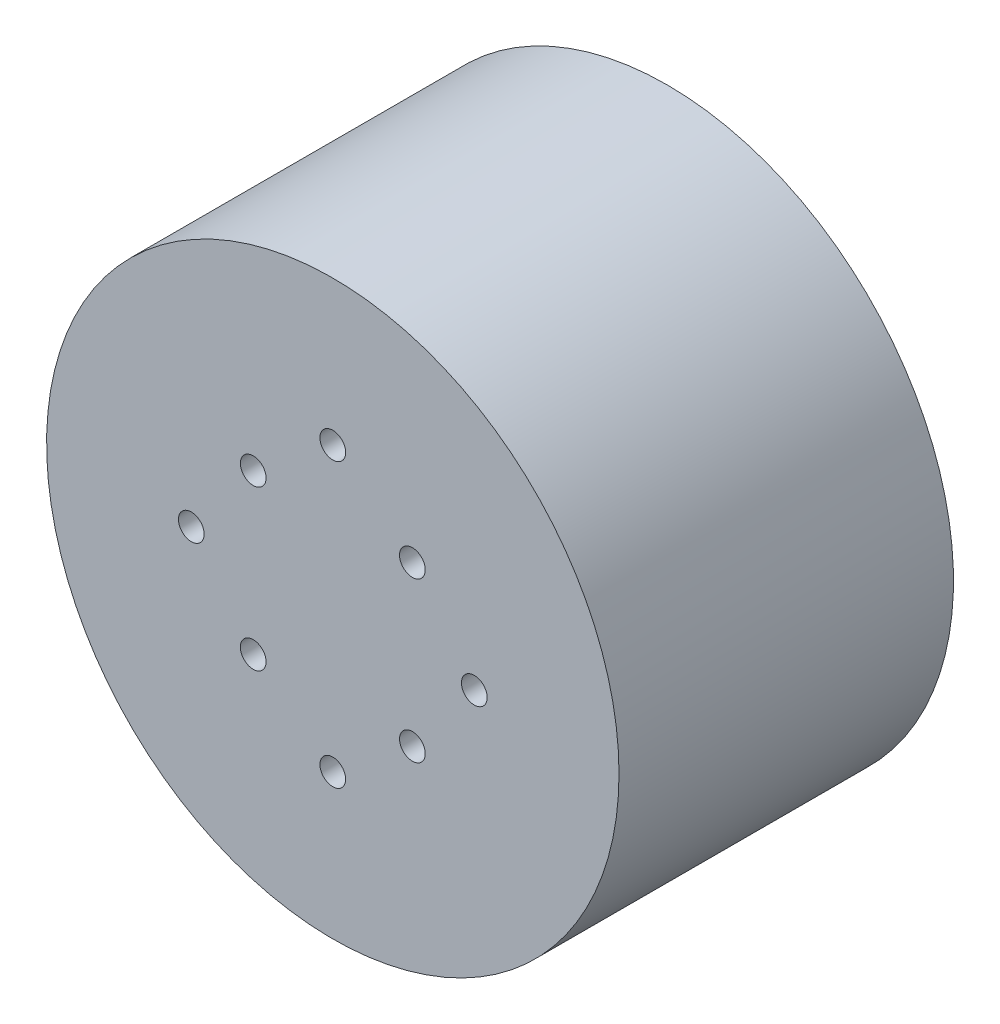
ISO-10303-21;
HEADER;
FILE_DESCRIPTION(('STEP AP214'),'2;1');
FILE_NAME('part.step','',(''),(''),'','','');
FILE_SCHEMA(('AUTOMOTIVE_DESIGN { 1 0 10303 214 1 1 1 1 }'));
ENDSEC;
DATA;
#1=APPLICATION_CONTEXT('core data for automotive mechanical design processes');
#2=APPLICATION_PROTOCOL_DEFINITION('international standard','automotive_design',2000,#1);
#3=PRODUCT_CONTEXT('',#1,'mechanical');
#4=PRODUCT('Part','Part','',(#3));
#5=PRODUCT_RELATED_PRODUCT_CATEGORY('part','',(#4));
#6=PRODUCT_DEFINITION_FORMATION('','',#4);
#7=PRODUCT_DEFINITION_CONTEXT('part definition',#1,'design');
#8=PRODUCT_DEFINITION('design','',#6,#7);
#9=PRODUCT_DEFINITION_SHAPE('','',#8);
#10=(LENGTH_UNIT() NAMED_UNIT(*) SI_UNIT(.MILLI.,.METRE.));
#11=(NAMED_UNIT(*) PLANE_ANGLE_UNIT() SI_UNIT($,.RADIAN.));
#12=(NAMED_UNIT(*) SI_UNIT($,.STERADIAN.) SOLID_ANGLE_UNIT());
#13=UNCERTAINTY_MEASURE_WITH_UNIT(LENGTH_MEASURE(1.E-05),#10,'distance_accuracy_value','');
#14=(GEOMETRIC_REPRESENTATION_CONTEXT(3) GLOBAL_UNCERTAINTY_ASSIGNED_CONTEXT((#13)) GLOBAL_UNIT_ASSIGNED_CONTEXT((#10,
#11,#12)) REPRESENTATION_CONTEXT('',''));
#15=CARTESIAN_POINT('',(0.,0.,0.));
#16=DIRECTION('',(0.,0.,1.));
#17=DIRECTION('',(1.,0.,0.));
#18=AXIS2_PLACEMENT_3D('',#15,#16,#17);
#19=CARTESIAN_POINT('',(0.,0.,52.));
#20=DIRECTION('',(0.,0.,-1.));
#21=DIRECTION('',(-1.,0.,0.));
#22=AXIS2_PLACEMENT_3D('',#19,#20,#21);
#23=CYLINDRICAL_SURFACE('',#22,44.5);
#24=CARTESIAN_POINT('',(0.,0.,52.));
#25=DIRECTION('',(0.,0.,1.));
#26=DIRECTION('',(1.,0.,0.));
#27=AXIS2_PLACEMENT_3D('',#24,#25,#26);
#28=CIRCLE('',#27,44.5);
#29=CARTESIAN_POINT('',(44.5,0.,52.));
#30=VERTEX_POINT('',#29);
#31=EDGE_CURVE('E222',#30,#30,#28,.T.);
#32=ORIENTED_EDGE('',*,*,#31,.F.);
#33=EDGE_LOOP('',(#32));
#34=FACE_BOUND('',#33,.T.);
#35=CARTESIAN_POINT('',(0.,0.,10.));
#36=DIRECTION('',(0.,0.,1.));
#37=DIRECTION('',(1.,0.,0.));
#38=AXIS2_PLACEMENT_3D('',#35,#36,#37);
#39=CIRCLE('',#38,44.5);
#40=CARTESIAN_POINT('',(-38.5046726518453,22.3078502768473,10.));
#41=VERTEX_POINT('',#40);
#42=CARTESIAN_POINT('',(-38.5046726518453,-22.3078502768473,10.));
#43=VERTEX_POINT('',#42);
#44=EDGE_CURVE('E11',#41,#43,#39,.T.);
#45=ORIENTED_EDGE('',*,*,#44,.T.);
#46=DIRECTION('',(0.,0.,-1.));
#47=VECTOR('',#46,1.);
#48=CARTESIAN_POINT('',(-38.5046726518453,-22.3078502768473,52.));
#49=LINE('',#48,#47);
#50=CARTESIAN_POINT('',(-38.5046726518453,-22.3078502768473,0.));
#51=VERTEX_POINT('',#50);
#52=EDGE_CURVE('E146',#43,#51,#49,.T.);
#53=ORIENTED_EDGE('',*,*,#52,.T.);
#54=CARTESIAN_POINT('',(0.,0.,0.));
#55=DIRECTION('',(0.,0.,1.));
#56=DIRECTION('',(1.,0.,0.));
#57=AXIS2_PLACEMENT_3D('',#54,#55,#56);
#58=CIRCLE('',#57,44.5);
#59=CARTESIAN_POINT('',(-38.5046726518453,22.3078502768473,0.));
#60=VERTEX_POINT('',#59);
#61=EDGE_CURVE('E221',#51,#60,#58,.T.);
#62=ORIENTED_EDGE('',*,*,#61,.T.);
#63=DIRECTION('',(0.,0.,-1.));
#64=VECTOR('',#63,1.);
#65=CARTESIAN_POINT('',(-38.5046726518453,22.3078502768473,52.));
#66=LINE('',#65,#64);
#67=EDGE_CURVE('E61',#60,#41,#66,.F.);
#68=ORIENTED_EDGE('',*,*,#67,.T.);
#69=EDGE_LOOP('',(#45,#53,#62,#68));
#70=FACE_BOUND('',#69,.T.);
#71=ADVANCED_FACE('F39',(#34,#70),#23,.T.);
#72=CARTESIAN_POINT('',(0.,0.,52.));
#73=DIRECTION('',(0.,0.,1.));
#74=DIRECTION('',(1.,0.,0.));
#75=AXIS2_PLACEMENT_3D('',#72,#73,#74);
#76=PLANE('',#75);
#77=CARTESIAN_POINT('',(22.,0.,52.));
#78=DIRECTION('',(0.,0.,1.));
#79=DIRECTION('',(0.,-1.,0.));
#80=AXIS2_PLACEMENT_3D('',#77,#78,#79);
#81=CIRCLE('',#80,2.);
#82=CARTESIAN_POINT('',(22.,-2.00000000000008,52.));
#83=VERTEX_POINT('',#82);
#84=EDGE_CURVE('E154',#83,#83,#81,.T.);
#85=ORIENTED_EDGE('',*,*,#84,.F.);
#86=EDGE_LOOP('',(#85));
#87=FACE_BOUND('',#86,.T.);
#88=CARTESIAN_POINT('',(12.3743686707645,-12.3743686707646,52.));
#89=DIRECTION('',(0.,0.,1.));
#90=DIRECTION('',(0.,-1.,0.));
#91=AXIS2_PLACEMENT_3D('',#88,#89,#90);
#92=CIRCLE('',#91,2.);
#93=CARTESIAN_POINT('',(12.3743686707645,-14.3743686707646,52.));
#94=VERTEX_POINT('',#93);
#95=EDGE_CURVE('E160',#94,#94,#92,.T.);
#96=ORIENTED_EDGE('',*,*,#95,.F.);
#97=EDGE_LOOP('',(#96));
#98=FACE_BOUND('',#97,.T.);
#99=CARTESIAN_POINT('',(0.,-22.,52.));
#100=DIRECTION('',(0.,0.,1.));
#101=DIRECTION('',(-1.,0.,0.));
#102=AXIS2_PLACEMENT_3D('',#99,#100,#101);
#103=CIRCLE('',#102,2.);
#104=CARTESIAN_POINT('',(-2.,-22.,52.));
#105=VERTEX_POINT('',#104);
#106=EDGE_CURVE('E166',#105,#105,#103,.T.);
#107=ORIENTED_EDGE('',*,*,#106,.F.);
#108=EDGE_LOOP('',(#107));
#109=FACE_BOUND('',#108,.T.);
#110=CARTESIAN_POINT('',(-12.3743686707646,-12.3743686707646,52.));
#111=DIRECTION('',(0.,0.,1.));
#112=DIRECTION('',(-1.,0.,0.));
#113=AXIS2_PLACEMENT_3D('',#110,#111,#112);
#114=CIRCLE('',#113,2.);
#115=CARTESIAN_POINT('',(-14.3743686707646,-12.3743686707646,52.));
#116=VERTEX_POINT('',#115);
#117=EDGE_CURVE('E172',#116,#116,#114,.T.);
#118=ORIENTED_EDGE('',*,*,#117,.F.);
#119=EDGE_LOOP('',(#118));
#120=FACE_BOUND('',#119,.T.);
#121=CARTESIAN_POINT('',(-22.,2.30437768363647E-13,52.));
#122=DIRECTION('',(0.,0.,1.));
#123=DIRECTION('',(0.,1.,0.));
#124=AXIS2_PLACEMENT_3D('',#121,#122,#123);
#125=CIRCLE('',#124,2.);
#126=CARTESIAN_POINT('',(-22.,2.00000000000023,52.));
#127=VERTEX_POINT('',#126);
#128=EDGE_CURVE('E178',#127,#127,#125,.T.);
#129=ORIENTED_EDGE('',*,*,#128,.F.);
#130=EDGE_LOOP('',(#129));
#131=FACE_BOUND('',#130,.T.);
#132=CARTESIAN_POINT('',(-12.3743686707644,12.3743686707647,52.));
#133=DIRECTION('',(0.,0.,1.));
#134=DIRECTION('',(0.,1.,0.));
#135=AXIS2_PLACEMENT_3D('',#132,#133,#134);
#136=CIRCLE('',#135,2.);
#137=CARTESIAN_POINT('',(-12.3743686707644,14.3743686707647,52.));
#138=VERTEX_POINT('',#137);
#139=EDGE_CURVE('E149',#138,#138,#136,.T.);
#140=ORIENTED_EDGE('',*,*,#139,.F.);
#141=EDGE_LOOP('',(#140));
#142=FACE_BOUND('',#141,.T.);
#143=CARTESIAN_POINT('',(0.,22.,52.));
#144=DIRECTION('',(0.,0.,1.));
#145=DIRECTION('',(1.,0.,0.));
#146=AXIS2_PLACEMENT_3D('',#143,#144,#145);
#147=CIRCLE('',#146,2.);
#148=CARTESIAN_POINT('',(2.,22.,52.));
#149=VERTEX_POINT('',#148);
#150=EDGE_CURVE('E190',#149,#149,#147,.T.);
#151=ORIENTED_EDGE('',*,*,#150,.F.);
#152=EDGE_LOOP('',(#151));
#153=FACE_BOUND('',#152,.T.);
#154=CARTESIAN_POINT('',(12.3743686707646,12.3743686707646,52.));
#155=DIRECTION('',(0.,0.,1.));
#156=DIRECTION('',(1.,0.,0.));
#157=AXIS2_PLACEMENT_3D('',#154,#155,#156);
#158=CIRCLE('',#157,2.);
#159=CARTESIAN_POINT('',(14.3743686707646,12.3743686707646,52.));
#160=VERTEX_POINT('',#159);
#161=EDGE_CURVE('E153',#160,#160,#158,.T.);
#162=ORIENTED_EDGE('',*,*,#161,.F.);
#163=EDGE_LOOP('',(#162));
#164=FACE_BOUND('',#163,.T.);
#165=ORIENTED_EDGE('',*,*,#31,.T.);
#166=EDGE_LOOP('',(#165));
#167=FACE_BOUND('',#166,.T.);
#168=ADVANCED_FACE('F248',(#87,#98,#109,#120,#131,#142,#153,#164,#167),#76,.T.);
#169=CARTESIAN_POINT('',(0.,0.,0.));
#170=DIRECTION('',(0.,0.,1.));
#171=DIRECTION('',(1.,0.,0.));
#172=AXIS2_PLACEMENT_3D('',#169,#170,#171);
#173=PLANE('',#172);
#174=CARTESIAN_POINT('',(15.,15.,0.));
#175=DIRECTION('',(0.,0.,-1.));
#176=DIRECTION('',(-1.,0.,0.));
#177=AXIS2_PLACEMENT_3D('',#174,#175,#176);
#178=CIRCLE('',#177,1.64999999999999);
#179=CARTESIAN_POINT('',(13.35,15.,0.));
#180=VERTEX_POINT('',#179);
#181=EDGE_CURVE('E189',#180,#180,#178,.T.);
#182=ORIENTED_EDGE('',*,*,#181,.F.);
#183=EDGE_LOOP('',(#182));
#184=FACE_BOUND('',#183,.T.);
#185=CARTESIAN_POINT('',(-15.,15.,0.));
#186=DIRECTION('',(0.,0.,-1.));
#187=DIRECTION('',(-1.,0.,0.));
#188=AXIS2_PLACEMENT_3D('',#185,#186,#187);
#189=CIRCLE('',#188,1.64999999999999);
#190=CARTESIAN_POINT('',(-16.65,15.,0.));
#191=VERTEX_POINT('',#190);
#192=EDGE_CURVE('E203',#191,#191,#189,.T.);
#193=ORIENTED_EDGE('',*,*,#192,.F.);
#194=EDGE_LOOP('',(#193));
#195=FACE_BOUND('',#194,.T.);
#196=CARTESIAN_POINT('',(-15.,-15.,0.));
#197=DIRECTION('',(0.,0.,-1.));
#198=DIRECTION('',(-1.,0.,0.));
#199=AXIS2_PLACEMENT_3D('',#196,#197,#198);
#200=CIRCLE('',#199,1.64999999999999);
#201=CARTESIAN_POINT('',(-16.65,-15.,0.));
#202=VERTEX_POINT('',#201);
#203=EDGE_CURVE('E209',#202,#202,#200,.T.);
#204=ORIENTED_EDGE('',*,*,#203,.F.);
#205=EDGE_LOOP('',(#204));
#206=FACE_BOUND('',#205,.T.);
#207=CARTESIAN_POINT('',(15.,-15.,0.));
#208=DIRECTION('',(0.,0.,-1.));
#209=DIRECTION('',(-1.,0.,0.));
#210=AXIS2_PLACEMENT_3D('',#207,#208,#209);
#211=CIRCLE('',#210,1.64999999999999);
#212=CARTESIAN_POINT('',(13.35,-15.,0.));
#213=VERTEX_POINT('',#212);
#214=EDGE_CURVE('E215',#213,#213,#211,.T.);
#215=ORIENTED_EDGE('',*,*,#214,.F.);
#216=EDGE_LOOP('',(#215));
#217=FACE_BOUND('',#216,.T.);
#218=ORIENTED_EDGE('',*,*,#61,.F.);
#219=DIRECTION('',(0.,1.,0.));
#220=VECTOR('',#219,1.);
#221=CARTESIAN_POINT('',(-38.5046726518453,0.,0.));
#222=LINE('',#221,#220);
#223=EDGE_CURVE('E46',#51,#60,#222,.T.);
#224=ORIENTED_EDGE('',*,*,#223,.T.);
#225=EDGE_LOOP('',(#218,#224));
#226=FACE_BOUND('',#225,.T.);
#227=ADVANCED_FACE('F228',(#184,#195,#206,#217,#226),#173,.F.);
#228=CARTESIAN_POINT('',(15.,-15.,12.));
#229=DIRECTION('',(0.,0.,-1.));
#230=DIRECTION('',(-1.,0.,0.));
#231=AXIS2_PLACEMENT_3D('',#228,#229,#230);
#232=CONICAL_SURFACE('',#231,1.64999999999999,1.02974425867665);
#233=CARTESIAN_POINT('',(15.,-15.,12.9914200213955));
#234=VERTEX_POINT('',#233);
#235=VERTEX_LOOP('',#234);
#236=FACE_BOUND('',#235,.T.);
#237=CARTESIAN_POINT('',(15.,-15.,12.));
#238=DIRECTION('',(0.,0.,-1.));
#239=DIRECTION('',(-1.,0.,0.));
#240=AXIS2_PLACEMENT_3D('',#237,#238,#239);
#241=CIRCLE('',#240,1.64999999999999);
#242=CARTESIAN_POINT('',(13.35,-15.,12.));
#243=VERTEX_POINT('',#242);
#244=EDGE_CURVE('E218',#243,#243,#241,.T.);
#245=ORIENTED_EDGE('',*,*,#244,.T.);
#246=EDGE_LOOP('',(#245));
#247=FACE_BOUND('',#246,.T.);
#248=ADVANCED_FACE('F261',(#236,#247),#232,.F.);
#249=CARTESIAN_POINT('',(15.,-15.,0.));
#250=DIRECTION('',(0.,0.,-1.));
#251=DIRECTION('',(-1.,0.,0.));
#252=AXIS2_PLACEMENT_3D('',#249,#250,#251);
#253=CYLINDRICAL_SURFACE('',#252,1.64999999999999);
#254=ORIENTED_EDGE('',*,*,#244,.F.);
#255=EDGE_LOOP('',(#254));
#256=FACE_BOUND('',#255,.T.);
#257=ORIENTED_EDGE('',*,*,#214,.T.);
#258=EDGE_LOOP('',(#257));
#259=FACE_BOUND('',#258,.T.);
#260=ADVANCED_FACE('F268',(#256,#259),#253,.F.);
#261=CARTESIAN_POINT('',(-15.,-15.,12.));
#262=DIRECTION('',(0.,0.,-1.));
#263=DIRECTION('',(-1.,0.,0.));
#264=AXIS2_PLACEMENT_3D('',#261,#262,#263);
#265=CONICAL_SURFACE('',#264,1.64999999999999,1.02974425867665);
#266=CARTESIAN_POINT('',(-15.,-15.,12.9914200213955));
#267=VERTEX_POINT('',#266);
#268=VERTEX_LOOP('',#267);
#269=FACE_BOUND('',#268,.T.);
#270=CARTESIAN_POINT('',(-15.,-15.,12.));
#271=DIRECTION('',(0.,0.,-1.));
#272=DIRECTION('',(-1.,0.,0.));
#273=AXIS2_PLACEMENT_3D('',#270,#271,#272);
#274=CIRCLE('',#273,1.64999999999999);
#275=CARTESIAN_POINT('',(-16.65,-15.,12.));
#276=VERTEX_POINT('',#275);
#277=EDGE_CURVE('E212',#276,#276,#274,.T.);
#278=ORIENTED_EDGE('',*,*,#277,.T.);
#279=EDGE_LOOP('',(#278));
#280=FACE_BOUND('',#279,.T.);
#281=ADVANCED_FACE('F272',(#269,#280),#265,.F.);
#282=CARTESIAN_POINT('',(-15.,-15.,0.));
#283=DIRECTION('',(0.,0.,-1.));
#284=DIRECTION('',(-1.,0.,0.));
#285=AXIS2_PLACEMENT_3D('',#282,#283,#284);
#286=CYLINDRICAL_SURFACE('',#285,1.64999999999999);
#287=ORIENTED_EDGE('',*,*,#277,.F.);
#288=EDGE_LOOP('',(#287));
#289=FACE_BOUND('',#288,.T.);
#290=ORIENTED_EDGE('',*,*,#203,.T.);
#291=EDGE_LOOP('',(#290));
#292=FACE_BOUND('',#291,.T.);
#293=ADVANCED_FACE('F276',(#289,#292),#286,.F.);
#294=CARTESIAN_POINT('',(-15.,15.,12.));
#295=DIRECTION('',(0.,0.,-1.));
#296=DIRECTION('',(-1.,0.,0.));
#297=AXIS2_PLACEMENT_3D('',#294,#295,#296);
#298=CONICAL_SURFACE('',#297,1.64999999999999,1.02974425867665);
#299=CARTESIAN_POINT('',(-15.,15.,12.9914200213955));
#300=VERTEX_POINT('',#299);
#301=VERTEX_LOOP('',#300);
#302=FACE_BOUND('',#301,.T.);
#303=CARTESIAN_POINT('',(-15.,15.,12.));
#304=DIRECTION('',(0.,0.,-1.));
#305=DIRECTION('',(-1.,0.,0.));
#306=AXIS2_PLACEMENT_3D('',#303,#304,#305);
#307=CIRCLE('',#306,1.64999999999999);
#308=CARTESIAN_POINT('',(-16.65,15.,12.));
#309=VERTEX_POINT('',#308);
#310=EDGE_CURVE('E206',#309,#309,#307,.T.);
#311=ORIENTED_EDGE('',*,*,#310,.T.);
#312=EDGE_LOOP('',(#311));
#313=FACE_BOUND('',#312,.T.);
#314=ADVANCED_FACE('F280',(#302,#313),#298,.F.);
#315=CARTESIAN_POINT('',(-15.,15.,0.));
#316=DIRECTION('',(0.,0.,-1.));
#317=DIRECTION('',(-1.,0.,0.));
#318=AXIS2_PLACEMENT_3D('',#315,#316,#317);
#319=CYLINDRICAL_SURFACE('',#318,1.64999999999999);
#320=ORIENTED_EDGE('',*,*,#310,.F.);
#321=EDGE_LOOP('',(#320));
#322=FACE_BOUND('',#321,.T.);
#323=ORIENTED_EDGE('',*,*,#192,.T.);
#324=EDGE_LOOP('',(#323));
#325=FACE_BOUND('',#324,.T.);
#326=ADVANCED_FACE('F284',(#322,#325),#319,.F.);
#327=CARTESIAN_POINT('',(15.,15.,12.));
#328=DIRECTION('',(0.,0.,-1.));
#329=DIRECTION('',(-1.,0.,0.));
#330=AXIS2_PLACEMENT_3D('',#327,#328,#329);
#331=CONICAL_SURFACE('',#330,1.64999999999999,1.02974425867665);
#332=CARTESIAN_POINT('',(15.,15.,12.9914200213955));
#333=VERTEX_POINT('',#332);
#334=VERTEX_LOOP('',#333);
#335=FACE_BOUND('',#334,.T.);
#336=CARTESIAN_POINT('',(15.,15.,12.));
#337=DIRECTION('',(0.,0.,-1.));
#338=DIRECTION('',(-1.,0.,0.));
#339=AXIS2_PLACEMENT_3D('',#336,#337,#338);
#340=CIRCLE('',#339,1.64999999999999);
#341=CARTESIAN_POINT('',(13.35,15.,12.));
#342=VERTEX_POINT('',#341);
#343=EDGE_CURVE('E200',#342,#342,#340,.T.);
#344=ORIENTED_EDGE('',*,*,#343,.T.);
#345=EDGE_LOOP('',(#344));
#346=FACE_BOUND('',#345,.T.);
#347=ADVANCED_FACE('F288',(#335,#346),#331,.F.);
#348=CARTESIAN_POINT('',(15.,15.,0.));
#349=DIRECTION('',(0.,0.,-1.));
#350=DIRECTION('',(-1.,0.,0.));
#351=AXIS2_PLACEMENT_3D('',#348,#349,#350);
#352=CYLINDRICAL_SURFACE('',#351,1.64999999999999);
#353=ORIENTED_EDGE('',*,*,#343,.F.);
#354=EDGE_LOOP('',(#353));
#355=FACE_BOUND('',#354,.T.);
#356=ORIENTED_EDGE('',*,*,#181,.T.);
#357=EDGE_LOOP('',(#356));
#358=FACE_BOUND('',#357,.T.);
#359=ADVANCED_FACE('F292',(#355,#358),#352,.F.);
#360=CARTESIAN_POINT('',(12.3743686707646,12.3743686707646,42.));
#361=DIRECTION('',(0.,0.,1.));
#362=DIRECTION('',(1.,0.,0.));
#363=AXIS2_PLACEMENT_3D('',#360,#361,#362);
#364=CYLINDRICAL_SURFACE('',#363,2.);
#365=CARTESIAN_POINT('',(12.3743686707646,12.3743686707646,42.));
#366=DIRECTION('',(0.,0.,1.));
#367=DIRECTION('',(1.,0.,0.));
#368=AXIS2_PLACEMENT_3D('',#365,#366,#367);
#369=CIRCLE('',#368,2.);
#370=CARTESIAN_POINT('',(14.3743686707646,12.3743686707646,42.));
#371=VERTEX_POINT('',#370);
#372=EDGE_CURVE('E193',#371,#371,#369,.T.);
#373=ORIENTED_EDGE('',*,*,#372,.F.);
#374=EDGE_LOOP('',(#373));
#375=FACE_BOUND('',#374,.T.);
#376=ORIENTED_EDGE('',*,*,#161,.T.);
#377=EDGE_LOOP('',(#376));
#378=FACE_BOUND('',#377,.T.);
#379=ADVANCED_FACE('F296',(#375,#378),#364,.F.);
#380=CARTESIAN_POINT('',(12.3743686707646,12.3743686707646,42.));
#381=DIRECTION('',(0.,0.,1.));
#382=DIRECTION('',(1.,0.,0.));
#383=AXIS2_PLACEMENT_3D('',#380,#381,#382);
#384=PLANE('',#383);
#385=ORIENTED_EDGE('',*,*,#372,.T.);
#386=EDGE_LOOP('',(#385));
#387=FACE_BOUND('',#386,.T.);
#388=ADVANCED_FACE('F300',(#387),#384,.T.);
#389=CARTESIAN_POINT('',(0.,22.,42.));
#390=DIRECTION('',(0.,0.,1.));
#391=DIRECTION('',(1.,0.,0.));
#392=AXIS2_PLACEMENT_3D('',#389,#390,#391);
#393=CYLINDRICAL_SURFACE('',#392,2.);
#394=CARTESIAN_POINT('',(0.,22.,42.));
#395=DIRECTION('',(0.,0.,1.));
#396=DIRECTION('',(1.,0.,0.));
#397=AXIS2_PLACEMENT_3D('',#394,#395,#396);
#398=CIRCLE('',#397,2.);
#399=CARTESIAN_POINT('',(2.,22.,42.));
#400=VERTEX_POINT('',#399);
#401=EDGE_CURVE('E186',#400,#400,#398,.T.);
#402=ORIENTED_EDGE('',*,*,#401,.F.);
#403=EDGE_LOOP('',(#402));
#404=FACE_BOUND('',#403,.T.);
#405=ORIENTED_EDGE('',*,*,#150,.T.);
#406=EDGE_LOOP('',(#405));
#407=FACE_BOUND('',#406,.T.);
#408=ADVANCED_FACE('F304',(#404,#407),#393,.F.);
#409=CARTESIAN_POINT('',(0.,22.,42.));
#410=DIRECTION('',(0.,0.,1.));
#411=DIRECTION('',(1.,0.,0.));
#412=AXIS2_PLACEMENT_3D('',#409,#410,#411);
#413=PLANE('',#412);
#414=ORIENTED_EDGE('',*,*,#401,.T.);
#415=EDGE_LOOP('',(#414));
#416=FACE_BOUND('',#415,.T.);
#417=ADVANCED_FACE('F308',(#416),#413,.T.);
#418=CARTESIAN_POINT('',(-12.3743686707644,12.3743686707647,42.));
#419=DIRECTION('',(0.,0.,1.));
#420=DIRECTION('',(1.,0.,0.));
#421=AXIS2_PLACEMENT_3D('',#418,#419,#420);
#422=CYLINDRICAL_SURFACE('',#421,2.);
#423=CARTESIAN_POINT('',(-12.3743686707644,12.3743686707647,42.));
#424=DIRECTION('',(0.,0.,1.));
#425=DIRECTION('',(0.,1.,0.));
#426=AXIS2_PLACEMENT_3D('',#423,#424,#425);
#427=CIRCLE('',#426,2.);
#428=CARTESIAN_POINT('',(-12.3743686707644,14.3743686707647,42.));
#429=VERTEX_POINT('',#428);
#430=EDGE_CURVE('E181',#429,#429,#427,.T.);
#431=ORIENTED_EDGE('',*,*,#430,.F.);
#432=EDGE_LOOP('',(#431));
#433=FACE_BOUND('',#432,.T.);
#434=ORIENTED_EDGE('',*,*,#139,.T.);
#435=EDGE_LOOP('',(#434));
#436=FACE_BOUND('',#435,.T.);
#437=ADVANCED_FACE('F311',(#433,#436),#422,.F.);
#438=CARTESIAN_POINT('',(-12.3743686707644,12.3743686707647,42.));
#439=DIRECTION('',(0.,0.,1.));
#440=DIRECTION('',(0.,1.,0.));
#441=AXIS2_PLACEMENT_3D('',#438,#439,#440);
#442=PLANE('',#441);
#443=ORIENTED_EDGE('',*,*,#430,.T.);
#444=EDGE_LOOP('',(#443));
#445=FACE_BOUND('',#444,.T.);
#446=ADVANCED_FACE('F314',(#445),#442,.T.);
#447=CARTESIAN_POINT('',(-22.,2.30437768363647E-13,42.));
#448=DIRECTION('',(0.,0.,1.));
#449=DIRECTION('',(1.,0.,0.));
#450=AXIS2_PLACEMENT_3D('',#447,#448,#449);
#451=CYLINDRICAL_SURFACE('',#450,2.);
#452=CARTESIAN_POINT('',(-22.,2.30437768363647E-13,42.));
#453=DIRECTION('',(0.,0.,1.));
#454=DIRECTION('',(0.,1.,0.));
#455=AXIS2_PLACEMENT_3D('',#452,#453,#454);
#456=CIRCLE('',#455,2.);
#457=CARTESIAN_POINT('',(-22.,2.00000000000023,42.));
#458=VERTEX_POINT('',#457);
#459=EDGE_CURVE('E175',#458,#458,#456,.T.);
#460=ORIENTED_EDGE('',*,*,#459,.F.);
#461=EDGE_LOOP('',(#460));
#462=FACE_BOUND('',#461,.T.);
#463=ORIENTED_EDGE('',*,*,#128,.T.);
#464=EDGE_LOOP('',(#463));
#465=FACE_BOUND('',#464,.T.);
#466=ADVANCED_FACE('F318',(#462,#465),#451,.F.);
#467=CARTESIAN_POINT('',(-22.,2.30437768363647E-13,42.));
#468=DIRECTION('',(0.,0.,1.));
#469=DIRECTION('',(0.,1.,0.));
#470=AXIS2_PLACEMENT_3D('',#467,#468,#469);
#471=PLANE('',#470);
#472=ORIENTED_EDGE('',*,*,#459,.T.);
#473=EDGE_LOOP('',(#472));
#474=FACE_BOUND('',#473,.T.);
#475=ADVANCED_FACE('F322',(#474),#471,.T.);
#476=CARTESIAN_POINT('',(-12.3743686707646,-12.3743686707646,42.));
#477=DIRECTION('',(0.,0.,1.));
#478=DIRECTION('',(1.,0.,0.));
#479=AXIS2_PLACEMENT_3D('',#476,#477,#478);
#480=CYLINDRICAL_SURFACE('',#479,2.);
#481=CARTESIAN_POINT('',(-12.3743686707646,-12.3743686707646,42.));
#482=DIRECTION('',(0.,0.,1.));
#483=DIRECTION('',(-1.,0.,0.));
#484=AXIS2_PLACEMENT_3D('',#481,#482,#483);
#485=CIRCLE('',#484,2.);
#486=CARTESIAN_POINT('',(-14.3743686707646,-12.3743686707646,42.));
#487=VERTEX_POINT('',#486);
#488=EDGE_CURVE('E169',#487,#487,#485,.T.);
#489=ORIENTED_EDGE('',*,*,#488,.F.);
#490=EDGE_LOOP('',(#489));
#491=FACE_BOUND('',#490,.T.);
#492=ORIENTED_EDGE('',*,*,#117,.T.);
#493=EDGE_LOOP('',(#492));
#494=FACE_BOUND('',#493,.T.);
#495=ADVANCED_FACE('F326',(#491,#494),#480,.F.);
#496=CARTESIAN_POINT('',(-12.3743686707646,-12.3743686707646,42.));
#497=DIRECTION('',(0.,0.,1.));
#498=DIRECTION('',(-1.,0.,0.));
#499=AXIS2_PLACEMENT_3D('',#496,#497,#498);
#500=PLANE('',#499);
#501=ORIENTED_EDGE('',*,*,#488,.T.);
#502=EDGE_LOOP('',(#501));
#503=FACE_BOUND('',#502,.T.);
#504=ADVANCED_FACE('F330',(#503),#500,.T.);
#505=CARTESIAN_POINT('',(0.,-22.,42.));
#506=DIRECTION('',(0.,0.,1.));
#507=DIRECTION('',(1.,0.,0.));
#508=AXIS2_PLACEMENT_3D('',#505,#506,#507);
#509=CYLINDRICAL_SURFACE('',#508,2.);
#510=CARTESIAN_POINT('',(0.,-22.,42.));
#511=DIRECTION('',(0.,0.,1.));
#512=DIRECTION('',(-1.,0.,0.));
#513=AXIS2_PLACEMENT_3D('',#510,#511,#512);
#514=CIRCLE('',#513,2.);
#515=CARTESIAN_POINT('',(-2.,-22.,42.));
#516=VERTEX_POINT('',#515);
#517=EDGE_CURVE('E163',#516,#516,#514,.T.);
#518=ORIENTED_EDGE('',*,*,#517,.F.);
#519=EDGE_LOOP('',(#518));
#520=FACE_BOUND('',#519,.T.);
#521=ORIENTED_EDGE('',*,*,#106,.T.);
#522=EDGE_LOOP('',(#521));
#523=FACE_BOUND('',#522,.T.);
#524=ADVANCED_FACE('F334',(#520,#523),#509,.F.);
#525=CARTESIAN_POINT('',(0.,-22.,42.));
#526=DIRECTION('',(0.,0.,1.));
#527=DIRECTION('',(-1.,0.,0.));
#528=AXIS2_PLACEMENT_3D('',#525,#526,#527);
#529=PLANE('',#528);
#530=ORIENTED_EDGE('',*,*,#517,.T.);
#531=EDGE_LOOP('',(#530));
#532=FACE_BOUND('',#531,.T.);
#533=ADVANCED_FACE('F338',(#532),#529,.T.);
#534=CARTESIAN_POINT('',(12.3743686707645,-12.3743686707646,42.));
#535=DIRECTION('',(0.,0.,1.));
#536=DIRECTION('',(1.,0.,0.));
#537=AXIS2_PLACEMENT_3D('',#534,#535,#536);
#538=CYLINDRICAL_SURFACE('',#537,2.);
#539=CARTESIAN_POINT('',(12.3743686707645,-12.3743686707646,42.));
#540=DIRECTION('',(0.,0.,1.));
#541=DIRECTION('',(0.,-1.,0.));
#542=AXIS2_PLACEMENT_3D('',#539,#540,#541);
#543=CIRCLE('',#542,2.);
#544=CARTESIAN_POINT('',(12.3743686707645,-14.3743686707646,42.));
#545=VERTEX_POINT('',#544);
#546=EDGE_CURVE('E157',#545,#545,#543,.T.);
#547=ORIENTED_EDGE('',*,*,#546,.F.);
#548=EDGE_LOOP('',(#547));
#549=FACE_BOUND('',#548,.T.);
#550=ORIENTED_EDGE('',*,*,#95,.T.);
#551=EDGE_LOOP('',(#550));
#552=FACE_BOUND('',#551,.T.);
#553=ADVANCED_FACE('F342',(#549,#552),#538,.F.);
#554=CARTESIAN_POINT('',(12.3743686707645,-12.3743686707646,42.));
#555=DIRECTION('',(0.,0.,1.));
#556=DIRECTION('',(0.,-1.,0.));
#557=AXIS2_PLACEMENT_3D('',#554,#555,#556);
#558=PLANE('',#557);
#559=ORIENTED_EDGE('',*,*,#546,.T.);
#560=EDGE_LOOP('',(#559));
#561=FACE_BOUND('',#560,.T.);
#562=ADVANCED_FACE('F346',(#561),#558,.T.);
#563=CARTESIAN_POINT('',(22.,0.,42.));
#564=DIRECTION('',(0.,0.,1.));
#565=DIRECTION('',(1.,0.,0.));
#566=AXIS2_PLACEMENT_3D('',#563,#564,#565);
#567=CYLINDRICAL_SURFACE('',#566,2.);
#568=CARTESIAN_POINT('',(22.,0.,42.));
#569=DIRECTION('',(0.,0.,1.));
#570=DIRECTION('',(0.,-1.,0.));
#571=AXIS2_PLACEMENT_3D('',#568,#569,#570);
#572=CIRCLE('',#571,2.);
#573=CARTESIAN_POINT('',(22.,-2.00000000000008,42.));
#574=VERTEX_POINT('',#573);
#575=EDGE_CURVE('E150',#574,#574,#572,.T.);
#576=ORIENTED_EDGE('',*,*,#575,.F.);
#577=EDGE_LOOP('',(#576));
#578=FACE_BOUND('',#577,.T.);
#579=ORIENTED_EDGE('',*,*,#84,.T.);
#580=EDGE_LOOP('',(#579));
#581=FACE_BOUND('',#580,.T.);
#582=ADVANCED_FACE('F243',(#578,#581),#567,.F.);
#583=CARTESIAN_POINT('',(22.,0.,42.));
#584=DIRECTION('',(0.,0.,1.));
#585=DIRECTION('',(0.,-1.,0.));
#586=AXIS2_PLACEMENT_3D('',#583,#584,#585);
#587=PLANE('',#586);
#588=ORIENTED_EDGE('',*,*,#575,.T.);
#589=EDGE_LOOP('',(#588));
#590=FACE_BOUND('',#589,.T.);
#591=ADVANCED_FACE('F234',(#590),#587,.T.);
#592=CARTESIAN_POINT('',(0.,0.,10.));
#593=DIRECTION('',(0.,0.,1.));
#594=DIRECTION('',(1.,0.,0.));
#595=AXIS2_PLACEMENT_3D('',#592,#593,#594);
#596=PLANE('',#595);
#597=DIRECTION('',(0.,-1.,0.));
#598=VECTOR('',#597,1.);
#599=CARTESIAN_POINT('',(-38.5046726518453,-26.0165636682029,10.));
#600=LINE('',#599,#598);
#601=EDGE_CURVE('E139',#41,#43,#600,.T.);
#602=ORIENTED_EDGE('',*,*,#601,.T.);
#603=ORIENTED_EDGE('',*,*,#44,.F.);
#604=EDGE_LOOP('',(#602,#603));
#605=FACE_BOUND('',#604,.T.);
#606=ADVANCED_FACE('F232',(#605),#596,.F.);
#607=CARTESIAN_POINT('',(-38.5046726518453,-26.0165636682029,10.));
#608=DIRECTION('',(1.,0.,0.));
#609=DIRECTION('',(0.,0.,-1.));
#610=AXIS2_PLACEMENT_3D('',#607,#608,#609);
#611=PLANE('',#610);
#612=DIRECTION('',(0.,0.,1.));
#613=VECTOR('',#612,1.);
#614=CARTESIAN_POINT('',(-38.5046726518453,-14.85322403461,2.71282307021181));
#615=LINE('',#614,#613);
#616=CARTESIAN_POINT('',(-38.5046726518453,-14.85322403461,2.71282307021181));
#617=VERTEX_POINT('',#616);
#618=CARTESIAN_POINT('',(-38.5046726518453,-14.85322403461,7.95811416438141));
#619=VERTEX_POINT('',#618);
#620=EDGE_CURVE('E133',#617,#619,#615,.T.);
#621=ORIENTED_EDGE('',*,*,#620,.F.);
#622=DIRECTION('',(0.,-1.,0.));
#623=VECTOR('',#622,1.);
#624=CARTESIAN_POINT('',(-38.5046726518453,-14.85322403461,2.71282307021181));
#625=LINE('',#624,#623);
#626=CARTESIAN_POINT('',(-38.5046726518453,14.1993245944576,2.71282307021181));
#627=VERTEX_POINT('',#626);
#628=EDGE_CURVE('E53',#627,#617,#625,.T.);
#629=ORIENTED_EDGE('',*,*,#628,.F.);
#630=DIRECTION('',(0.,0.,-1.));
#631=VECTOR('',#630,1.);
#632=CARTESIAN_POINT('',(-38.5046726518453,14.1993245944576,2.71282307021181));
#633=LINE('',#632,#631);
#634=CARTESIAN_POINT('',(-38.5046726518453,14.1993245944576,7.95811416438141));
#635=VERTEX_POINT('',#634);
#636=EDGE_CURVE('E124',#635,#627,#633,.T.);
#637=ORIENTED_EDGE('',*,*,#636,.F.);
#638=DIRECTION('',(0.,1.,0.));
#639=VECTOR('',#638,1.);
#640=CARTESIAN_POINT('',(-38.5046726518453,-14.85322403461,7.95811416438141));
#641=LINE('',#640,#639);
#642=EDGE_CURVE('E127',#619,#635,#641,.T.);
#643=ORIENTED_EDGE('',*,*,#642,.F.);
#644=EDGE_LOOP('',(#621,#629,#637,#643));
#645=FACE_BOUND('',#644,.T.);
#646=ORIENTED_EDGE('',*,*,#601,.F.);
#647=ORIENTED_EDGE('',*,*,#67,.F.);
#648=ORIENTED_EDGE('',*,*,#223,.F.);
#649=ORIENTED_EDGE('',*,*,#52,.F.);
#650=EDGE_LOOP('',(#646,#647,#648,#649));
#651=FACE_BOUND('',#650,.T.);
#652=ADVANCED_FACE('F230',(#645,#651),#611,.F.);
#653=CARTESIAN_POINT('',(-28.5046726518453,-14.85322403461,2.71282307021181));
#654=DIRECTION('',(0.,0.,-1.));
#655=DIRECTION('',(-1.,0.,0.));
#656=AXIS2_PLACEMENT_3D('',#653,#654,#655);
#657=PLANE('',#656);
#658=ORIENTED_EDGE('',*,*,#628,.T.);
#659=DIRECTION('',(-1.,0.,0.));
#660=VECTOR('',#659,1.);
#661=CARTESIAN_POINT('',(-28.5046726518453,-14.85322403461,2.71282307021181));
#662=LINE('',#661,#660);
#663=CARTESIAN_POINT('',(-28.5046726518453,-14.85322403461,2.71282307021181));
#664=VERTEX_POINT('',#663);
#665=EDGE_CURVE('E102',#664,#617,#662,.T.);
#666=ORIENTED_EDGE('',*,*,#665,.F.);
#667=DIRECTION('',(0.,-1.,0.));
#668=VECTOR('',#667,1.);
#669=CARTESIAN_POINT('',(-28.5046726518453,-14.85322403461,2.71282307021181));
#670=LINE('',#669,#668);
#671=CARTESIAN_POINT('',(-28.5046726518453,14.1993245944576,2.71282307021181));
#672=VERTEX_POINT('',#671);
#673=EDGE_CURVE('E106',#672,#664,#670,.T.);
#674=ORIENTED_EDGE('',*,*,#673,.F.);
#675=DIRECTION('',(-1.,0.,0.));
#676=VECTOR('',#675,1.);
#677=CARTESIAN_POINT('',(-28.5046726518453,14.1993245944576,2.71282307021181));
#678=LINE('',#677,#676);
#679=EDGE_CURVE('E137',#672,#627,#678,.T.);
#680=ORIENTED_EDGE('',*,*,#679,.T.);
#681=EDGE_LOOP('',(#658,#666,#674,#680));
#682=FACE_BOUND('',#681,.T.);
#683=ADVANCED_FACE('F104',(#682),#657,.F.);
#684=CARTESIAN_POINT('',(-28.5046726518453,14.1993245944576,2.71282307021181));
#685=DIRECTION('',(0.,1.,0.));
#686=DIRECTION('',(0.,0.,1.));
#687=AXIS2_PLACEMENT_3D('',#684,#685,#686);
#688=PLANE('',#687);
#689=ORIENTED_EDGE('',*,*,#636,.T.);
#690=ORIENTED_EDGE('',*,*,#679,.F.);
#691=DIRECTION('',(0.,0.,-1.));
#692=VECTOR('',#691,1.);
#693=CARTESIAN_POINT('',(-28.5046726518453,14.1993245944576,2.71282307021181));
#694=LINE('',#693,#692);
#695=CARTESIAN_POINT('',(-28.5046726518453,14.1993245944576,7.95811416438141));
#696=VERTEX_POINT('',#695);
#697=EDGE_CURVE('E112',#696,#672,#694,.T.);
#698=ORIENTED_EDGE('',*,*,#697,.F.);
#699=DIRECTION('',(-1.,0.,0.));
#700=VECTOR('',#699,1.);
#701=CARTESIAN_POINT('',(-28.5046726518453,14.1993245944576,7.95811416438141));
#702=LINE('',#701,#700);
#703=EDGE_CURVE('E140',#696,#635,#702,.T.);
#704=ORIENTED_EDGE('',*,*,#703,.T.);
#705=EDGE_LOOP('',(#689,#690,#698,#704));
#706=FACE_BOUND('',#705,.T.);
#707=ADVANCED_FACE('F376',(#706),#688,.F.);
#708=CARTESIAN_POINT('',(-28.5046726518453,-14.85322403461,7.95811416438141));
#709=DIRECTION('',(0.,0.,1.));
#710=DIRECTION('',(1.,0.,0.));
#711=AXIS2_PLACEMENT_3D('',#708,#709,#710);
#712=PLANE('',#711);
#713=ORIENTED_EDGE('',*,*,#642,.T.);
#714=ORIENTED_EDGE('',*,*,#703,.F.);
#715=DIRECTION('',(0.,1.,0.));
#716=VECTOR('',#715,1.);
#717=CARTESIAN_POINT('',(-28.5046726518453,-14.85322403461,7.95811416438141));
#718=LINE('',#717,#716);
#719=CARTESIAN_POINT('',(-28.5046726518453,-14.85322403461,7.95811416438141));
#720=VERTEX_POINT('',#719);
#721=EDGE_CURVE('E120',#720,#696,#718,.T.);
#722=ORIENTED_EDGE('',*,*,#721,.F.);
#723=DIRECTION('',(-1.,0.,0.));
#724=VECTOR('',#723,1.);
#725=CARTESIAN_POINT('',(-28.5046726518453,-14.85322403461,7.95811416438141));
#726=LINE('',#725,#724);
#727=EDGE_CURVE('E111',#720,#619,#726,.T.);
#728=ORIENTED_EDGE('',*,*,#727,.T.);
#729=EDGE_LOOP('',(#713,#714,#722,#728));
#730=FACE_BOUND('',#729,.T.);
#731=ADVANCED_FACE('F382',(#730),#712,.F.);
#732=CARTESIAN_POINT('',(-28.5046726518453,-14.85322403461,2.71282307021181));
#733=DIRECTION('',(0.,-1.,0.));
#734=DIRECTION('',(0.,0.,-1.));
#735=AXIS2_PLACEMENT_3D('',#732,#733,#734);
#736=PLANE('',#735);
#737=ORIENTED_EDGE('',*,*,#620,.T.);
#738=ORIENTED_EDGE('',*,*,#727,.F.);
#739=DIRECTION('',(0.,0.,1.));
#740=VECTOR('',#739,1.);
#741=CARTESIAN_POINT('',(-28.5046726518453,-14.85322403461,2.71282307021181));
#742=LINE('',#741,#740);
#743=EDGE_CURVE('E115',#664,#720,#742,.T.);
#744=ORIENTED_EDGE('',*,*,#743,.F.);
#745=ORIENTED_EDGE('',*,*,#665,.T.);
#746=EDGE_LOOP('',(#737,#738,#744,#745));
#747=FACE_BOUND('',#746,.T.);
#748=ADVANCED_FACE('F116',(#747),#736,.F.);
#749=CARTESIAN_POINT('',(-28.5046726518453,0.,0.));
#750=DIRECTION('',(1.,0.,0.));
#751=DIRECTION('',(0.,0.,-1.));
#752=AXIS2_PLACEMENT_3D('',#749,#750,#751);
#753=PLANE('',#752);
#754=ORIENTED_EDGE('',*,*,#673,.T.);
#755=ORIENTED_EDGE('',*,*,#743,.T.);
#756=ORIENTED_EDGE('',*,*,#721,.T.);
#757=ORIENTED_EDGE('',*,*,#697,.T.);
#758=EDGE_LOOP('',(#754,#755,#756,#757));
#759=FACE_BOUND('',#758,.T.);
#760=ADVANCED_FACE('F122',(#759),#753,.F.);
#761=CLOSED_SHELL('',(#71,#168,#227,#248,#260,#281,#293,#314,#326,#347,#359,#379,#388,#408,#417,
#437,#446,#466,#475,#495,#504,#524,#533,#553,#562,#582,#591,#606,#652,#683,#707,#731,#748,#760));
#762=MANIFOLD_SOLID_BREP('B2',#761);
#763=ADVANCED_BREP_SHAPE_REPRESENTATION('',(#18,#762),#14);
#764=SHAPE_DEFINITION_REPRESENTATION(#9,#763);
ENDSEC;
END-ISO-10303-21;
